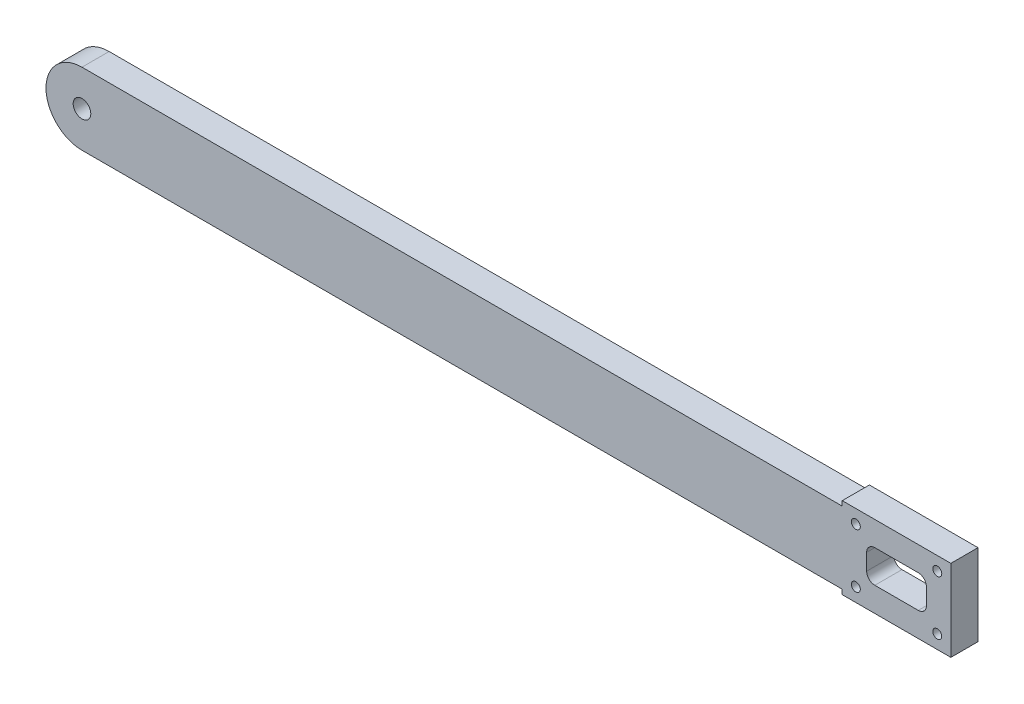
ISO-10303-21;
HEADER;
FILE_DESCRIPTION(('STEP AP214'),'2;1');
FILE_NAME('part.step','',(''),(''),'','','');
FILE_SCHEMA(('AUTOMOTIVE_DESIGN { 1 0 10303 214 1 1 1 1 }'));
ENDSEC;
DATA;
#1=APPLICATION_CONTEXT('core data for automotive mechanical design processes');
#2=APPLICATION_PROTOCOL_DEFINITION('international standard','automotive_design',2000,#1);
#3=PRODUCT_CONTEXT('',#1,'mechanical');
#4=PRODUCT('Part','Part','',(#3));
#5=PRODUCT_RELATED_PRODUCT_CATEGORY('part','',(#4));
#6=PRODUCT_DEFINITION_FORMATION('','',#4);
#7=PRODUCT_DEFINITION_CONTEXT('part definition',#1,'design');
#8=PRODUCT_DEFINITION('design','',#6,#7);
#9=PRODUCT_DEFINITION_SHAPE('','',#8);
#10=(LENGTH_UNIT() NAMED_UNIT(*) SI_UNIT(.MILLI.,.METRE.));
#11=(NAMED_UNIT(*) PLANE_ANGLE_UNIT() SI_UNIT($,.RADIAN.));
#12=(NAMED_UNIT(*) SI_UNIT($,.STERADIAN.) SOLID_ANGLE_UNIT());
#13=UNCERTAINTY_MEASURE_WITH_UNIT(LENGTH_MEASURE(1.E-05),#10,'distance_accuracy_value','');
#14=(GEOMETRIC_REPRESENTATION_CONTEXT(3) GLOBAL_UNCERTAINTY_ASSIGNED_CONTEXT((#13)) GLOBAL_UNIT_ASSIGNED_CONTEXT((#10,
#11,#12)) REPRESENTATION_CONTEXT('',''));
#15=CARTESIAN_POINT('',(0.,0.,0.));
#16=DIRECTION('',(0.,0.,1.));
#17=DIRECTION('',(1.,0.,0.));
#18=AXIS2_PLACEMENT_3D('',#15,#16,#17);
#19=CARTESIAN_POINT('',(0.,-6.,10.));
#20=DIRECTION('',(0.,1.,0.));
#21=DIRECTION('',(0.,0.,1.));
#22=AXIS2_PLACEMENT_3D('',#19,#20,#21);
#23=PLANE('',#22);
#24=DIRECTION('',(1.,0.,0.));
#25=VECTOR('',#24,1.);
#26=CARTESIAN_POINT('',(0.,-6.,0.));
#27=LINE('',#26,#25);
#28=CARTESIAN_POINT('',(292.,-6.,0.));
#29=VERTEX_POINT('',#28);
#30=CARTESIAN_POINT('',(308.,-6.,0.));
#31=VERTEX_POINT('',#30);
#32=EDGE_CURVE('E227',#29,#31,#27,.T.);
#33=ORIENTED_EDGE('',*,*,#32,.F.);
#34=DIRECTION('',(0.,0.,-1.));
#35=VECTOR('',#34,1.);
#36=CARTESIAN_POINT('',(292.,-6.,10.));
#37=LINE('',#36,#35);
#38=CARTESIAN_POINT('',(292.,-6.,10.));
#39=VERTEX_POINT('',#38);
#40=EDGE_CURVE('E11',#39,#29,#37,.T.);
#41=ORIENTED_EDGE('',*,*,#40,.F.);
#42=DIRECTION('',(1.,0.,0.));
#43=VECTOR('',#42,1.);
#44=CARTESIAN_POINT('',(0.,-6.,10.));
#45=LINE('',#44,#43);
#46=CARTESIAN_POINT('',(308.,-6.,10.));
#47=VERTEX_POINT('',#46);
#48=EDGE_CURVE('E547',#39,#47,#45,.T.);
#49=ORIENTED_EDGE('',*,*,#48,.T.);
#50=DIRECTION('',(0.,0.,-1.));
#51=VECTOR('',#50,1.);
#52=CARTESIAN_POINT('',(308.,-6.,10.));
#53=LINE('',#52,#51);
#54=EDGE_CURVE('E60',#47,#31,#53,.T.);
#55=ORIENTED_EDGE('',*,*,#54,.T.);
#56=EDGE_LOOP('',(#33,#41,#49,#55));
#57=FACE_BOUND('',#56,.T.);
#58=ADVANCED_FACE('F41',(#57),#23,.T.);
#59=CARTESIAN_POINT('',(292.,-3.,10.));
#60=DIRECTION('',(0.,0.,-1.));
#61=DIRECTION('',(-1.,0.,0.));
#62=AXIS2_PLACEMENT_3D('',#59,#60,#61);
#63=CYLINDRICAL_SURFACE('',#62,3.);
#64=CARTESIAN_POINT('',(292.,-3.,0.));
#65=DIRECTION('',(0.,0.,1.));
#66=DIRECTION('',(1.,0.,0.));
#67=AXIS2_PLACEMENT_3D('',#64,#65,#66);
#68=CIRCLE('',#67,3.);
#69=CARTESIAN_POINT('',(289.,-3.,0.));
#70=VERTEX_POINT('',#69);
#71=EDGE_CURVE('E229',#29,#70,#68,.F.);
#72=ORIENTED_EDGE('',*,*,#71,.T.);
#73=DIRECTION('',(0.,0.,-1.));
#74=VECTOR('',#73,1.);
#75=CARTESIAN_POINT('',(289.,-3.,10.));
#76=LINE('',#75,#74);
#77=CARTESIAN_POINT('',(289.,-3.,10.));
#78=VERTEX_POINT('',#77);
#79=EDGE_CURVE('E51',#78,#70,#76,.T.);
#80=ORIENTED_EDGE('',*,*,#79,.F.);
#81=CARTESIAN_POINT('',(292.,-3.,10.));
#82=DIRECTION('',(0.,0.,1.));
#83=DIRECTION('',(1.,0.,0.));
#84=AXIS2_PLACEMENT_3D('',#81,#82,#83);
#85=CIRCLE('',#84,3.);
#86=EDGE_CURVE('E545',#39,#78,#85,.F.);
#87=ORIENTED_EDGE('',*,*,#86,.F.);
#88=ORIENTED_EDGE('',*,*,#40,.T.);
#89=EDGE_LOOP('',(#72,#80,#87,#88));
#90=FACE_BOUND('',#89,.T.);
#91=ADVANCED_FACE('F332',(#90),#63,.F.);
#92=CARTESIAN_POINT('',(289.,0.,10.));
#93=DIRECTION('',(-1.,0.,0.));
#94=DIRECTION('',(0.,0.,1.));
#95=AXIS2_PLACEMENT_3D('',#92,#93,#94);
#96=PLANE('',#95);
#97=DIRECTION('',(0.,1.,0.));
#98=VECTOR('',#97,1.);
#99=CARTESIAN_POINT('',(289.,0.,0.));
#100=LINE('',#99,#98);
#101=CARTESIAN_POINT('',(289.,3.,0.));
#102=VERTEX_POINT('',#101);
#103=EDGE_CURVE('E232',#70,#102,#100,.T.);
#104=ORIENTED_EDGE('',*,*,#103,.T.);
#105=DIRECTION('',(0.,0.,-1.));
#106=VECTOR('',#105,1.);
#107=CARTESIAN_POINT('',(289.,3.,10.));
#108=LINE('',#107,#106);
#109=CARTESIAN_POINT('',(289.,3.,10.));
#110=VERTEX_POINT('',#109);
#111=EDGE_CURVE('E260',#110,#102,#108,.T.);
#112=ORIENTED_EDGE('',*,*,#111,.F.);
#113=DIRECTION('',(0.,1.,0.));
#114=VECTOR('',#113,1.);
#115=CARTESIAN_POINT('',(289.,0.,10.));
#116=LINE('',#115,#114);
#117=EDGE_CURVE('E541',#78,#110,#116,.T.);
#118=ORIENTED_EDGE('',*,*,#117,.F.);
#119=ORIENTED_EDGE('',*,*,#79,.T.);
#120=EDGE_LOOP('',(#104,#112,#118,#119));
#121=FACE_BOUND('',#120,.T.);
#122=ADVANCED_FACE('F337',(#121),#96,.F.);
#123=CARTESIAN_POINT('',(292.,3.,10.));
#124=DIRECTION('',(0.,0.,-1.));
#125=DIRECTION('',(-1.,0.,0.));
#126=AXIS2_PLACEMENT_3D('',#123,#124,#125);
#127=CYLINDRICAL_SURFACE('',#126,3.);
#128=CARTESIAN_POINT('',(292.,3.,0.));
#129=DIRECTION('',(0.,0.,1.));
#130=DIRECTION('',(1.,0.,0.));
#131=AXIS2_PLACEMENT_3D('',#128,#129,#130);
#132=CIRCLE('',#131,3.);
#133=CARTESIAN_POINT('',(292.,6.,0.));
#134=VERTEX_POINT('',#133);
#135=EDGE_CURVE('E235',#102,#134,#132,.F.);
#136=ORIENTED_EDGE('',*,*,#135,.T.);
#137=DIRECTION('',(0.,0.,-1.));
#138=VECTOR('',#137,1.);
#139=CARTESIAN_POINT('',(292.,6.,10.));
#140=LINE('',#139,#138);
#141=CARTESIAN_POINT('',(292.,6.,10.));
#142=VERTEX_POINT('',#141);
#143=EDGE_CURVE('E257',#142,#134,#140,.T.);
#144=ORIENTED_EDGE('',*,*,#143,.F.);
#145=CARTESIAN_POINT('',(292.,3.,10.));
#146=DIRECTION('',(0.,0.,1.));
#147=DIRECTION('',(1.,0.,0.));
#148=AXIS2_PLACEMENT_3D('',#145,#146,#147);
#149=CIRCLE('',#148,3.);
#150=EDGE_CURVE('E539',#110,#142,#149,.F.);
#151=ORIENTED_EDGE('',*,*,#150,.F.);
#152=ORIENTED_EDGE('',*,*,#111,.T.);
#153=EDGE_LOOP('',(#136,#144,#151,#152));
#154=FACE_BOUND('',#153,.T.);
#155=ADVANCED_FACE('F497',(#154),#127,.F.);
#156=CARTESIAN_POINT('',(0.,6.,10.));
#157=DIRECTION('',(0.,1.,0.));
#158=DIRECTION('',(0.,0.,1.));
#159=AXIS2_PLACEMENT_3D('',#156,#157,#158);
#160=PLANE('',#159);
#161=DIRECTION('',(1.,0.,0.));
#162=VECTOR('',#161,1.);
#163=CARTESIAN_POINT('',(0.,6.,0.));
#164=LINE('',#163,#162);
#165=CARTESIAN_POINT('',(308.,6.,0.));
#166=VERTEX_POINT('',#165);
#167=EDGE_CURVE('E238',#134,#166,#164,.T.);
#168=ORIENTED_EDGE('',*,*,#167,.T.);
#169=DIRECTION('',(0.,0.,-1.));
#170=VECTOR('',#169,1.);
#171=CARTESIAN_POINT('',(308.,6.,10.));
#172=LINE('',#171,#170);
#173=CARTESIAN_POINT('',(308.,6.,10.));
#174=VERTEX_POINT('',#173);
#175=EDGE_CURVE('E170',#174,#166,#172,.T.);
#176=ORIENTED_EDGE('',*,*,#175,.F.);
#177=DIRECTION('',(1.,0.,0.));
#178=VECTOR('',#177,1.);
#179=CARTESIAN_POINT('',(0.,6.,10.));
#180=LINE('',#179,#178);
#181=EDGE_CURVE('E180',#142,#174,#180,.T.);
#182=ORIENTED_EDGE('',*,*,#181,.F.);
#183=ORIENTED_EDGE('',*,*,#143,.T.);
#184=EDGE_LOOP('',(#168,#176,#182,#183));
#185=FACE_BOUND('',#184,.T.);
#186=ADVANCED_FACE('F489',(#185),#160,.F.);
#187=CARTESIAN_POINT('',(308.,3.,10.));
#188=DIRECTION('',(0.,0.,-1.));
#189=DIRECTION('',(-1.,0.,0.));
#190=AXIS2_PLACEMENT_3D('',#187,#188,#189);
#191=CYLINDRICAL_SURFACE('',#190,3.);
#192=CARTESIAN_POINT('',(308.,3.,0.));
#193=DIRECTION('',(0.,0.,1.));
#194=DIRECTION('',(1.,0.,0.));
#195=AXIS2_PLACEMENT_3D('',#192,#193,#194);
#196=CIRCLE('',#195,3.);
#197=CARTESIAN_POINT('',(311.,3.,0.));
#198=VERTEX_POINT('',#197);
#199=EDGE_CURVE('E166',#198,#166,#196,.T.);
#200=ORIENTED_EDGE('',*,*,#199,.F.);
#201=DIRECTION('',(0.,0.,-1.));
#202=VECTOR('',#201,1.);
#203=CARTESIAN_POINT('',(311.,3.,10.));
#204=LINE('',#203,#202);
#205=CARTESIAN_POINT('',(311.,3.,10.));
#206=VERTEX_POINT('',#205);
#207=EDGE_CURVE('E161',#206,#198,#204,.T.);
#208=ORIENTED_EDGE('',*,*,#207,.F.);
#209=CARTESIAN_POINT('',(308.,3.,10.));
#210=DIRECTION('',(0.,0.,1.));
#211=DIRECTION('',(1.,0.,0.));
#212=AXIS2_PLACEMENT_3D('',#209,#210,#211);
#213=CIRCLE('',#212,3.);
#214=EDGE_CURVE('E164',#206,#174,#213,.T.);
#215=ORIENTED_EDGE('',*,*,#214,.T.);
#216=ORIENTED_EDGE('',*,*,#175,.T.);
#217=EDGE_LOOP('',(#200,#208,#215,#216));
#218=FACE_BOUND('',#217,.T.);
#219=ADVANCED_FACE('F163',(#218),#191,.F.);
#220=CARTESIAN_POINT('',(311.,0.,10.));
#221=DIRECTION('',(-1.,0.,0.));
#222=DIRECTION('',(0.,0.,1.));
#223=AXIS2_PLACEMENT_3D('',#220,#221,#222);
#224=PLANE('',#223);
#225=DIRECTION('',(0.,1.,0.));
#226=VECTOR('',#225,1.);
#227=CARTESIAN_POINT('',(311.,0.,0.));
#228=LINE('',#227,#226);
#229=CARTESIAN_POINT('',(311.,-3.,0.));
#230=VERTEX_POINT('',#229);
#231=EDGE_CURVE('E242',#230,#198,#228,.T.);
#232=ORIENTED_EDGE('',*,*,#231,.F.);
#233=DIRECTION('',(0.,0.,-1.));
#234=VECTOR('',#233,1.);
#235=CARTESIAN_POINT('',(311.,-3.,10.));
#236=LINE('',#235,#234);
#237=CARTESIAN_POINT('',(311.,-3.,10.));
#238=VERTEX_POINT('',#237);
#239=EDGE_CURVE('E109',#238,#230,#236,.T.);
#240=ORIENTED_EDGE('',*,*,#239,.F.);
#241=DIRECTION('',(0.,1.,0.));
#242=VECTOR('',#241,1.);
#243=CARTESIAN_POINT('',(311.,0.,10.));
#244=LINE('',#243,#242);
#245=EDGE_CURVE('E178',#238,#206,#244,.T.);
#246=ORIENTED_EDGE('',*,*,#245,.T.);
#247=ORIENTED_EDGE('',*,*,#207,.T.);
#248=EDGE_LOOP('',(#232,#240,#246,#247));
#249=FACE_BOUND('',#248,.T.);
#250=ADVANCED_FACE('F183',(#249),#224,.T.);
#251=CARTESIAN_POINT('',(0.,13.25,10.));
#252=DIRECTION('',(0.,1.,0.));
#253=DIRECTION('',(0.,0.,1.));
#254=AXIS2_PLACEMENT_3D('',#251,#252,#253);
#255=PLANE('',#254);
#256=DIRECTION('',(1.,0.,0.));
#257=VECTOR('',#256,1.);
#258=CARTESIAN_POINT('',(0.,13.25,0.));
#259=LINE('',#258,#257);
#260=CARTESIAN_POINT('',(0.,13.25,0.));
#261=VERTEX_POINT('',#260);
#262=CARTESIAN_POINT('',(280.,13.25,0.));
#263=VERTEX_POINT('',#262);
#264=EDGE_CURVE('E199',#261,#263,#259,.T.);
#265=ORIENTED_EDGE('',*,*,#264,.F.);
#266=DIRECTION('',(0.,0.,-1.));
#267=VECTOR('',#266,1.);
#268=CARTESIAN_POINT('',(0.,13.25,10.));
#269=LINE('',#268,#267);
#270=CARTESIAN_POINT('',(0.,13.25,10.));
#271=VERTEX_POINT('',#270);
#272=EDGE_CURVE('E45',#271,#261,#269,.T.);
#273=ORIENTED_EDGE('',*,*,#272,.F.);
#274=DIRECTION('',(1.,0.,0.));
#275=VECTOR('',#274,1.);
#276=CARTESIAN_POINT('',(0.,13.25,10.));
#277=LINE('',#276,#275);
#278=CARTESIAN_POINT('',(280.,13.25,10.));
#279=VERTEX_POINT('',#278);
#280=EDGE_CURVE('E292',#271,#279,#277,.T.);
#281=ORIENTED_EDGE('',*,*,#280,.T.);
#282=DIRECTION('',(0.,0.,-1.));
#283=VECTOR('',#282,1.);
#284=CARTESIAN_POINT('',(280.,13.25,10.));
#285=LINE('',#284,#283);
#286=EDGE_CURVE('E195',#279,#263,#285,.T.);
#287=ORIENTED_EDGE('',*,*,#286,.T.);
#288=EDGE_LOOP('',(#265,#273,#281,#287));
#289=FACE_BOUND('',#288,.T.);
#290=ADVANCED_FACE('F291',(#289),#255,.T.);
#291=CARTESIAN_POINT('',(0.,0.,10.));
#292=DIRECTION('',(0.,0.,-1.));
#293=DIRECTION('',(-1.,0.,0.));
#294=AXIS2_PLACEMENT_3D('',#291,#292,#293);
#295=CYLINDRICAL_SURFACE('',#294,13.25);
#296=CARTESIAN_POINT('',(0.,0.,0.));
#297=DIRECTION('',(0.,0.,1.));
#298=DIRECTION('',(1.,0.,0.));
#299=AXIS2_PLACEMENT_3D('',#296,#297,#298);
#300=CIRCLE('',#299,13.25);
#301=CARTESIAN_POINT('',(0.,-13.25,0.));
#302=VERTEX_POINT('',#301);
#303=EDGE_CURVE('E202',#261,#302,#300,.T.);
#304=ORIENTED_EDGE('',*,*,#303,.T.);
#305=DIRECTION('',(0.,0.,-1.));
#306=VECTOR('',#305,1.);
#307=CARTESIAN_POINT('',(0.,-13.25,10.));
#308=LINE('',#307,#306);
#309=CARTESIAN_POINT('',(0.,-13.25,10.));
#310=VERTEX_POINT('',#309);
#311=EDGE_CURVE('E276',#310,#302,#308,.T.);
#312=ORIENTED_EDGE('',*,*,#311,.F.);
#313=CARTESIAN_POINT('',(0.,0.,10.));
#314=DIRECTION('',(0.,0.,1.));
#315=DIRECTION('',(1.,0.,0.));
#316=AXIS2_PLACEMENT_3D('',#313,#314,#315);
#317=CIRCLE('',#316,13.25);
#318=EDGE_CURVE('E284',#271,#310,#317,.T.);
#319=ORIENTED_EDGE('',*,*,#318,.F.);
#320=ORIENTED_EDGE('',*,*,#272,.T.);
#321=EDGE_LOOP('',(#304,#312,#319,#320));
#322=FACE_BOUND('',#321,.T.);
#323=ADVANCED_FACE('F282',(#322),#295,.T.);
#324=CARTESIAN_POINT('',(0.,-13.25,10.));
#325=DIRECTION('',(0.,1.,0.));
#326=DIRECTION('',(0.,0.,1.));
#327=AXIS2_PLACEMENT_3D('',#324,#325,#326);
#328=PLANE('',#327);
#329=DIRECTION('',(1.,0.,0.));
#330=VECTOR('',#329,1.);
#331=CARTESIAN_POINT('',(0.,-13.25,0.));
#332=LINE('',#331,#330);
#333=CARTESIAN_POINT('',(280.,-13.25,0.));
#334=VERTEX_POINT('',#333);
#335=EDGE_CURVE('E205',#302,#334,#332,.T.);
#336=ORIENTED_EDGE('',*,*,#335,.T.);
#337=DIRECTION('',(0.,0.,-1.));
#338=VECTOR('',#337,1.);
#339=CARTESIAN_POINT('',(280.,-13.25,10.));
#340=LINE('',#339,#338);
#341=CARTESIAN_POINT('',(280.,-13.25,10.));
#342=VERTEX_POINT('',#341);
#343=EDGE_CURVE('E275',#342,#334,#340,.T.);
#344=ORIENTED_EDGE('',*,*,#343,.F.);
#345=DIRECTION('',(1.,0.,0.));
#346=VECTOR('',#345,1.);
#347=CARTESIAN_POINT('',(0.,-13.25,10.));
#348=LINE('',#347,#346);
#349=EDGE_CURVE('E562',#310,#342,#348,.T.);
#350=ORIENTED_EDGE('',*,*,#349,.F.);
#351=ORIENTED_EDGE('',*,*,#311,.T.);
#352=EDGE_LOOP('',(#336,#344,#350,#351));
#353=FACE_BOUND('',#352,.T.);
#354=ADVANCED_FACE('F321',(#353),#328,.F.);
#355=CARTESIAN_POINT('',(280.,0.,10.));
#356=DIRECTION('',(-1.,0.,0.));
#357=DIRECTION('',(0.,0.,1.));
#358=AXIS2_PLACEMENT_3D('',#355,#356,#357);
#359=PLANE('',#358);
#360=DIRECTION('',(0.,1.,0.));
#361=VECTOR('',#360,1.);
#362=CARTESIAN_POINT('',(280.,0.,0.));
#363=LINE('',#362,#361);
#364=CARTESIAN_POINT('',(280.,-15.,0.));
#365=VERTEX_POINT('',#364);
#366=EDGE_CURVE('E208',#365,#334,#363,.T.);
#367=ORIENTED_EDGE('',*,*,#366,.F.);
#368=DIRECTION('',(0.,0.,-1.));
#369=VECTOR('',#368,1.);
#370=CARTESIAN_POINT('',(280.,-15.,10.));
#371=LINE('',#370,#369);
#372=CARTESIAN_POINT('',(280.,-15.,10.));
#373=VERTEX_POINT('',#372);
#374=EDGE_CURVE('E273',#373,#365,#371,.T.);
#375=ORIENTED_EDGE('',*,*,#374,.F.);
#376=DIRECTION('',(0.,1.,0.));
#377=VECTOR('',#376,1.);
#378=CARTESIAN_POINT('',(280.,0.,10.));
#379=LINE('',#378,#377);
#380=EDGE_CURVE('E320',#373,#342,#379,.T.);
#381=ORIENTED_EDGE('',*,*,#380,.T.);
#382=ORIENTED_EDGE('',*,*,#343,.T.);
#383=EDGE_LOOP('',(#367,#375,#381,#382));
#384=FACE_BOUND('',#383,.T.);
#385=ADVANCED_FACE('F316',(#384),#359,.T.);
#386=CARTESIAN_POINT('',(0.,-15.,10.));
#387=DIRECTION('',(0.,1.,0.));
#388=DIRECTION('',(0.,0.,1.));
#389=AXIS2_PLACEMENT_3D('',#386,#387,#388);
#390=PLANE('',#389);
#391=DIRECTION('',(1.,0.,0.));
#392=VECTOR('',#391,1.);
#393=CARTESIAN_POINT('',(0.,-15.,0.));
#394=LINE('',#393,#392);
#395=CARTESIAN_POINT('',(320.,-15.,0.));
#396=VERTEX_POINT('',#395);
#397=EDGE_CURVE('E211',#365,#396,#394,.T.);
#398=ORIENTED_EDGE('',*,*,#397,.T.);
#399=DIRECTION('',(0.,0.,-1.));
#400=VECTOR('',#399,1.);
#401=CARTESIAN_POINT('',(320.,-15.,10.));
#402=LINE('',#401,#400);
#403=CARTESIAN_POINT('',(320.,-15.,10.));
#404=VERTEX_POINT('',#403);
#405=EDGE_CURVE('E270',#404,#396,#402,.T.);
#406=ORIENTED_EDGE('',*,*,#405,.F.);
#407=DIRECTION('',(1.,0.,0.));
#408=VECTOR('',#407,1.);
#409=CARTESIAN_POINT('',(0.,-15.,10.));
#410=LINE('',#409,#408);
#411=EDGE_CURVE('E559',#373,#404,#410,.T.);
#412=ORIENTED_EDGE('',*,*,#411,.F.);
#413=ORIENTED_EDGE('',*,*,#374,.T.);
#414=EDGE_LOOP('',(#398,#406,#412,#413));
#415=FACE_BOUND('',#414,.T.);
#416=ADVANCED_FACE('F313',(#415),#390,.F.);
#417=CARTESIAN_POINT('',(320.,0.,10.));
#418=DIRECTION('',(-1.,0.,0.));
#419=DIRECTION('',(0.,0.,1.));
#420=AXIS2_PLACEMENT_3D('',#417,#418,#419);
#421=PLANE('',#420);
#422=DIRECTION('',(0.,1.,0.));
#423=VECTOR('',#422,1.);
#424=CARTESIAN_POINT('',(320.,0.,0.));
#425=LINE('',#424,#423);
#426=CARTESIAN_POINT('',(320.,15.,0.));
#427=VERTEX_POINT('',#426);
#428=EDGE_CURVE('E215',#396,#427,#425,.T.);
#429=ORIENTED_EDGE('',*,*,#428,.T.);
#430=DIRECTION('',(0.,0.,-1.));
#431=VECTOR('',#430,1.);
#432=CARTESIAN_POINT('',(320.,15.,10.));
#433=LINE('',#432,#431);
#434=CARTESIAN_POINT('',(320.,15.,10.));
#435=VERTEX_POINT('',#434);
#436=EDGE_CURVE('E268',#435,#427,#433,.T.);
#437=ORIENTED_EDGE('',*,*,#436,.F.);
#438=DIRECTION('',(0.,1.,0.));
#439=VECTOR('',#438,1.);
#440=CARTESIAN_POINT('',(320.,0.,10.));
#441=LINE('',#440,#439);
#442=EDGE_CURVE('E309',#404,#435,#441,.T.);
#443=ORIENTED_EDGE('',*,*,#442,.F.);
#444=ORIENTED_EDGE('',*,*,#405,.T.);
#445=EDGE_LOOP('',(#429,#437,#443,#444));
#446=FACE_BOUND('',#445,.T.);
#447=ADVANCED_FACE('F307',(#446),#421,.F.);
#448=CARTESIAN_POINT('',(0.,15.,10.));
#449=DIRECTION('',(0.,1.,0.));
#450=DIRECTION('',(0.,0.,1.));
#451=AXIS2_PLACEMENT_3D('',#448,#449,#450);
#452=PLANE('',#451);
#453=DIRECTION('',(1.,0.,0.));
#454=VECTOR('',#453,1.);
#455=CARTESIAN_POINT('',(0.,15.,0.));
#456=LINE('',#455,#454);
#457=CARTESIAN_POINT('',(280.,15.,0.));
#458=VERTEX_POINT('',#457);
#459=EDGE_CURVE('E218',#458,#427,#456,.T.);
#460=ORIENTED_EDGE('',*,*,#459,.F.);
#461=DIRECTION('',(0.,0.,-1.));
#462=VECTOR('',#461,1.);
#463=CARTESIAN_POINT('',(280.,15.,10.));
#464=LINE('',#463,#462);
#465=CARTESIAN_POINT('',(280.,15.,10.));
#466=VERTEX_POINT('',#465);
#467=EDGE_CURVE('E266',#466,#458,#464,.T.);
#468=ORIENTED_EDGE('',*,*,#467,.F.);
#469=DIRECTION('',(1.,0.,0.));
#470=VECTOR('',#469,1.);
#471=CARTESIAN_POINT('',(0.,15.,10.));
#472=LINE('',#471,#470);
#473=EDGE_CURVE('E305',#466,#435,#472,.T.);
#474=ORIENTED_EDGE('',*,*,#473,.T.);
#475=ORIENTED_EDGE('',*,*,#436,.T.);
#476=EDGE_LOOP('',(#460,#468,#474,#475));
#477=FACE_BOUND('',#476,.T.);
#478=ADVANCED_FACE('F301',(#477),#452,.T.);
#479=CARTESIAN_POINT('',(315.,-10.,10.));
#480=DIRECTION('',(0.,0.,-1.));
#481=DIRECTION('',(-1.,0.,0.));
#482=AXIS2_PLACEMENT_3D('',#479,#480,#481);
#483=CYLINDRICAL_SURFACE('',#482,1.64999999999993);
#484=CARTESIAN_POINT('',(315.,-10.,10.));
#485=DIRECTION('',(0.,0.,1.));
#486=DIRECTION('',(1.,0.,0.));
#487=AXIS2_PLACEMENT_3D('',#484,#485,#486);
#488=CIRCLE('',#487,1.64999999999993);
#489=CARTESIAN_POINT('',(316.65,-10.,10.));
#490=VERTEX_POINT('',#489);
#491=EDGE_CURVE('E186',#490,#490,#488,.T.);
#492=ORIENTED_EDGE('',*,*,#491,.T.);
#493=EDGE_LOOP('',(#492));
#494=FACE_BOUND('',#493,.T.);
#495=CARTESIAN_POINT('',(315.,-10.,0.));
#496=DIRECTION('',(0.,0.,1.));
#497=DIRECTION('',(1.,0.,0.));
#498=AXIS2_PLACEMENT_3D('',#495,#496,#497);
#499=CIRCLE('',#498,1.64999999999993);
#500=CARTESIAN_POINT('',(316.65,-10.,0.));
#501=VERTEX_POINT('',#500);
#502=EDGE_CURVE('E247',#501,#501,#499,.T.);
#503=ORIENTED_EDGE('',*,*,#502,.F.);
#504=EDGE_LOOP('',(#503));
#505=FACE_BOUND('',#504,.T.);
#506=ADVANCED_FACE('F354',(#494,#505),#483,.F.);
#507=CARTESIAN_POINT('',(308.,-3.,10.));
#508=DIRECTION('',(0.,0.,-1.));
#509=DIRECTION('',(-1.,0.,0.));
#510=AXIS2_PLACEMENT_3D('',#507,#508,#509);
#511=CYLINDRICAL_SURFACE('',#510,3.);
#512=CARTESIAN_POINT('',(308.,-3.,0.));
#513=DIRECTION('',(0.,0.,1.));
#514=DIRECTION('',(1.,0.,0.));
#515=AXIS2_PLACEMENT_3D('',#512,#513,#514);
#516=CIRCLE('',#515,3.);
#517=EDGE_CURVE('E244',#31,#230,#516,.T.);
#518=ORIENTED_EDGE('',*,*,#517,.F.);
#519=ORIENTED_EDGE('',*,*,#54,.F.);
#520=CARTESIAN_POINT('',(308.,-3.,10.));
#521=DIRECTION('',(0.,0.,1.));
#522=DIRECTION('',(1.,0.,0.));
#523=AXIS2_PLACEMENT_3D('',#520,#521,#522);
#524=CIRCLE('',#523,3.);
#525=EDGE_CURVE('E184',#47,#238,#524,.T.);
#526=ORIENTED_EDGE('',*,*,#525,.T.);
#527=ORIENTED_EDGE('',*,*,#239,.T.);
#528=EDGE_LOOP('',(#518,#519,#526,#527));
#529=FACE_BOUND('',#528,.T.);
#530=ADVANCED_FACE('F346',(#529),#511,.F.);
#531=CARTESIAN_POINT('',(285.,-10.,10.));
#532=DIRECTION('',(0.,0.,-1.));
#533=DIRECTION('',(-1.,0.,0.));
#534=AXIS2_PLACEMENT_3D('',#531,#532,#533);
#535=CYLINDRICAL_SURFACE('',#534,1.64999999999999);
#536=CARTESIAN_POINT('',(285.,-10.,10.));
#537=DIRECTION('',(0.,0.,1.));
#538=DIRECTION('',(1.,0.,0.));
#539=AXIS2_PLACEMENT_3D('',#536,#537,#538);
#540=CIRCLE('',#539,1.64999999999999);
#541=CARTESIAN_POINT('',(286.65,-10.,10.));
#542=VERTEX_POINT('',#541);
#543=EDGE_CURVE('E551',#542,#542,#540,.F.);
#544=ORIENTED_EDGE('',*,*,#543,.F.);
#545=EDGE_LOOP('',(#544));
#546=FACE_BOUND('',#545,.T.);
#547=CARTESIAN_POINT('',(285.,-10.,0.));
#548=DIRECTION('',(0.,0.,1.));
#549=DIRECTION('',(1.,0.,0.));
#550=AXIS2_PLACEMENT_3D('',#547,#548,#549);
#551=CIRCLE('',#550,1.64999999999999);
#552=CARTESIAN_POINT('',(286.65,-10.,0.));
#553=VERTEX_POINT('',#552);
#554=EDGE_CURVE('E224',#553,#553,#551,.F.);
#555=ORIENTED_EDGE('',*,*,#554,.T.);
#556=EDGE_LOOP('',(#555));
#557=FACE_BOUND('',#556,.T.);
#558=ADVANCED_FACE('F342',(#546,#557),#535,.F.);
#559=CARTESIAN_POINT('',(285.,10.,10.));
#560=DIRECTION('',(0.,0.,-1.));
#561=DIRECTION('',(-1.,0.,0.));
#562=AXIS2_PLACEMENT_3D('',#559,#560,#561);
#563=CYLINDRICAL_SURFACE('',#562,1.64999999999999);
#564=CARTESIAN_POINT('',(285.,10.,10.));
#565=DIRECTION('',(0.,0.,1.));
#566=DIRECTION('',(1.,0.,0.));
#567=AXIS2_PLACEMENT_3D('',#564,#565,#566);
#568=CIRCLE('',#567,1.64999999999999);
#569=CARTESIAN_POINT('',(286.65,10.,10.));
#570=VERTEX_POINT('',#569);
#571=EDGE_CURVE('E554',#570,#570,#568,.T.);
#572=ORIENTED_EDGE('',*,*,#571,.T.);
#573=EDGE_LOOP('',(#572));
#574=FACE_BOUND('',#573,.T.);
#575=CARTESIAN_POINT('',(285.,10.,0.));
#576=DIRECTION('',(0.,0.,1.));
#577=DIRECTION('',(1.,0.,0.));
#578=AXIS2_PLACEMENT_3D('',#575,#576,#577);
#579=CIRCLE('',#578,1.64999999999999);
#580=CARTESIAN_POINT('',(286.65,10.,0.));
#581=VERTEX_POINT('',#580);
#582=EDGE_CURVE('E221',#581,#581,#579,.T.);
#583=ORIENTED_EDGE('',*,*,#582,.F.);
#584=EDGE_LOOP('',(#583));
#585=FACE_BOUND('',#584,.T.);
#586=ADVANCED_FACE('F345',(#574,#585),#563,.F.);
#587=EDGE_CURVE('E212',#263,#458,#363,.T.);
#588=ORIENTED_EDGE('',*,*,#587,.F.);
#589=ORIENTED_EDGE('',*,*,#286,.F.);
#590=EDGE_CURVE('E297',#279,#466,#379,.T.);
#591=ORIENTED_EDGE('',*,*,#590,.T.);
#592=ORIENTED_EDGE('',*,*,#467,.T.);
#593=EDGE_LOOP('',(#588,#589,#591,#592));
#594=FACE_BOUND('',#593,.T.);
#595=ADVANCED_FACE('F296',(#594),#359,.T.);
#596=CARTESIAN_POINT('',(0.,0.,10.));
#597=DIRECTION('',(0.,0.,-1.));
#598=DIRECTION('',(-1.,0.,0.));
#599=AXIS2_PLACEMENT_3D('',#596,#597,#598);
#600=CYLINDRICAL_SURFACE('',#599,3.25);
#601=CARTESIAN_POINT('',(0.,0.,10.));
#602=DIRECTION('',(0.,0.,1.));
#603=DIRECTION('',(1.,0.,0.));
#604=AXIS2_PLACEMENT_3D('',#601,#602,#603);
#605=CIRCLE('',#604,3.25);
#606=CARTESIAN_POINT('',(3.25,0.,10.));
#607=VERTEX_POINT('',#606);
#608=EDGE_CURVE('E253',#607,#607,#605,.T.);
#609=ORIENTED_EDGE('',*,*,#608,.T.);
#610=EDGE_LOOP('',(#609));
#611=FACE_BOUND('',#610,.T.);
#612=CARTESIAN_POINT('',(0.,0.,0.));
#613=DIRECTION('',(0.,0.,1.));
#614=DIRECTION('',(1.,0.,0.));
#615=AXIS2_PLACEMENT_3D('',#612,#613,#614);
#616=CIRCLE('',#615,3.25);
#617=CARTESIAN_POINT('',(3.25,0.,0.));
#618=VERTEX_POINT('',#617);
#619=EDGE_CURVE('E196',#618,#618,#616,.T.);
#620=ORIENTED_EDGE('',*,*,#619,.F.);
#621=EDGE_LOOP('',(#620));
#622=FACE_BOUND('',#621,.T.);
#623=ADVANCED_FACE('F43',(#611,#622),#600,.F.);
#624=CARTESIAN_POINT('',(315.,10.,10.));
#625=DIRECTION('',(0.,0.,-1.));
#626=DIRECTION('',(-1.,0.,0.));
#627=AXIS2_PLACEMENT_3D('',#624,#625,#626);
#628=CYLINDRICAL_SURFACE('',#627,1.64999999999993);
#629=CARTESIAN_POINT('',(315.,10.,10.));
#630=DIRECTION('',(0.,0.,1.));
#631=DIRECTION('',(1.,0.,0.));
#632=AXIS2_PLACEMENT_3D('',#629,#630,#631);
#633=CIRCLE('',#632,1.64999999999993);
#634=CARTESIAN_POINT('',(316.65,10.,10.));
#635=VERTEX_POINT('',#634);
#636=EDGE_CURVE('E192',#635,#635,#633,.F.);
#637=ORIENTED_EDGE('',*,*,#636,.F.);
#638=EDGE_LOOP('',(#637));
#639=FACE_BOUND('',#638,.T.);
#640=CARTESIAN_POINT('',(315.,10.,0.));
#641=DIRECTION('',(0.,0.,1.));
#642=DIRECTION('',(1.,0.,0.));
#643=AXIS2_PLACEMENT_3D('',#640,#641,#642);
#644=CIRCLE('',#643,1.64999999999993);
#645=CARTESIAN_POINT('',(316.65,10.,0.));
#646=VERTEX_POINT('',#645);
#647=EDGE_CURVE('E250',#646,#646,#644,.F.);
#648=ORIENTED_EDGE('',*,*,#647,.T.);
#649=EDGE_LOOP('',(#648));
#650=FACE_BOUND('',#649,.T.);
#651=ADVANCED_FACE('F408',(#639,#650),#628,.F.);
#652=CARTESIAN_POINT('',(0.,0.,10.));
#653=DIRECTION('',(0.,0.,1.));
#654=DIRECTION('',(1.,0.,0.));
#655=AXIS2_PLACEMENT_3D('',#652,#653,#654);
#656=PLANE('',#655);
#657=ORIENTED_EDGE('',*,*,#608,.F.);
#658=EDGE_LOOP('',(#657));
#659=FACE_BOUND('',#658,.T.);
#660=ORIENTED_EDGE('',*,*,#280,.F.);
#661=ORIENTED_EDGE('',*,*,#318,.T.);
#662=ORIENTED_EDGE('',*,*,#349,.T.);
#663=ORIENTED_EDGE('',*,*,#380,.F.);
#664=ORIENTED_EDGE('',*,*,#411,.T.);
#665=ORIENTED_EDGE('',*,*,#442,.T.);
#666=ORIENTED_EDGE('',*,*,#473,.F.);
#667=ORIENTED_EDGE('',*,*,#590,.F.);
#668=EDGE_LOOP('',(#660,#661,#662,#663,#664,#665,#666,#667));
#669=FACE_BOUND('',#668,.T.);
#670=ORIENTED_EDGE('',*,*,#571,.F.);
#671=EDGE_LOOP('',(#670));
#672=FACE_BOUND('',#671,.T.);
#673=ORIENTED_EDGE('',*,*,#543,.T.);
#674=EDGE_LOOP('',(#673));
#675=FACE_BOUND('',#674,.T.);
#676=ORIENTED_EDGE('',*,*,#48,.F.);
#677=ORIENTED_EDGE('',*,*,#86,.T.);
#678=ORIENTED_EDGE('',*,*,#117,.T.);
#679=ORIENTED_EDGE('',*,*,#150,.T.);
#680=ORIENTED_EDGE('',*,*,#181,.T.);
#681=ORIENTED_EDGE('',*,*,#214,.F.);
#682=ORIENTED_EDGE('',*,*,#245,.F.);
#683=ORIENTED_EDGE('',*,*,#525,.F.);
#684=EDGE_LOOP('',(#676,#677,#678,#679,#680,#681,#682,#683));
#685=FACE_BOUND('',#684,.T.);
#686=ORIENTED_EDGE('',*,*,#491,.F.);
#687=EDGE_LOOP('',(#686));
#688=FACE_BOUND('',#687,.T.);
#689=ORIENTED_EDGE('',*,*,#636,.T.);
#690=EDGE_LOOP('',(#689));
#691=FACE_BOUND('',#690,.T.);
#692=ADVANCED_FACE('F175',(#659,#669,#672,#675,#685,#688,#691),#656,.T.);
#693=CARTESIAN_POINT('',(0.,0.,0.));
#694=DIRECTION('',(0.,0.,1.));
#695=DIRECTION('',(1.,0.,0.));
#696=AXIS2_PLACEMENT_3D('',#693,#694,#695);
#697=PLANE('',#696);
#698=ORIENTED_EDGE('',*,*,#619,.T.);
#699=EDGE_LOOP('',(#698));
#700=FACE_BOUND('',#699,.T.);
#701=ORIENTED_EDGE('',*,*,#264,.T.);
#702=ORIENTED_EDGE('',*,*,#587,.T.);
#703=ORIENTED_EDGE('',*,*,#459,.T.);
#704=ORIENTED_EDGE('',*,*,#428,.F.);
#705=ORIENTED_EDGE('',*,*,#397,.F.);
#706=ORIENTED_EDGE('',*,*,#366,.T.);
#707=ORIENTED_EDGE('',*,*,#335,.F.);
#708=ORIENTED_EDGE('',*,*,#303,.F.);
#709=EDGE_LOOP('',(#701,#702,#703,#704,#705,#706,#707,#708));
#710=FACE_BOUND('',#709,.T.);
#711=ORIENTED_EDGE('',*,*,#582,.T.);
#712=EDGE_LOOP('',(#711));
#713=FACE_BOUND('',#712,.T.);
#714=ORIENTED_EDGE('',*,*,#554,.F.);
#715=EDGE_LOOP('',(#714));
#716=FACE_BOUND('',#715,.T.);
#717=ORIENTED_EDGE('',*,*,#32,.T.);
#718=ORIENTED_EDGE('',*,*,#517,.T.);
#719=ORIENTED_EDGE('',*,*,#231,.T.);
#720=ORIENTED_EDGE('',*,*,#199,.T.);
#721=ORIENTED_EDGE('',*,*,#167,.F.);
#722=ORIENTED_EDGE('',*,*,#135,.F.);
#723=ORIENTED_EDGE('',*,*,#103,.F.);
#724=ORIENTED_EDGE('',*,*,#71,.F.);
#725=EDGE_LOOP('',(#717,#718,#719,#720,#721,#722,#723,#724));
#726=FACE_BOUND('',#725,.T.);
#727=ORIENTED_EDGE('',*,*,#502,.T.);
#728=EDGE_LOOP('',(#727));
#729=FACE_BOUND('',#728,.T.);
#730=ORIENTED_EDGE('',*,*,#647,.F.);
#731=EDGE_LOOP('',(#730));
#732=FACE_BOUND('',#731,.T.);
#733=ADVANCED_FACE('F287',(#700,#710,#713,#716,#726,#729,#732),#697,.F.);
#734=CLOSED_SHELL('',(#58,#91,#122,#155,#186,#219,#250,#290,#323,#354,#385,#416,#447,#478,#506,
#530,#558,#586,#595,#623,#651,#692,#733));
#735=MANIFOLD_SOLID_BREP('B2',#734);
#736=ADVANCED_BREP_SHAPE_REPRESENTATION('',(#18,#735),#14);
#737=SHAPE_DEFINITION_REPRESENTATION(#9,#736);
ENDSEC;
END-ISO-10303-21;
